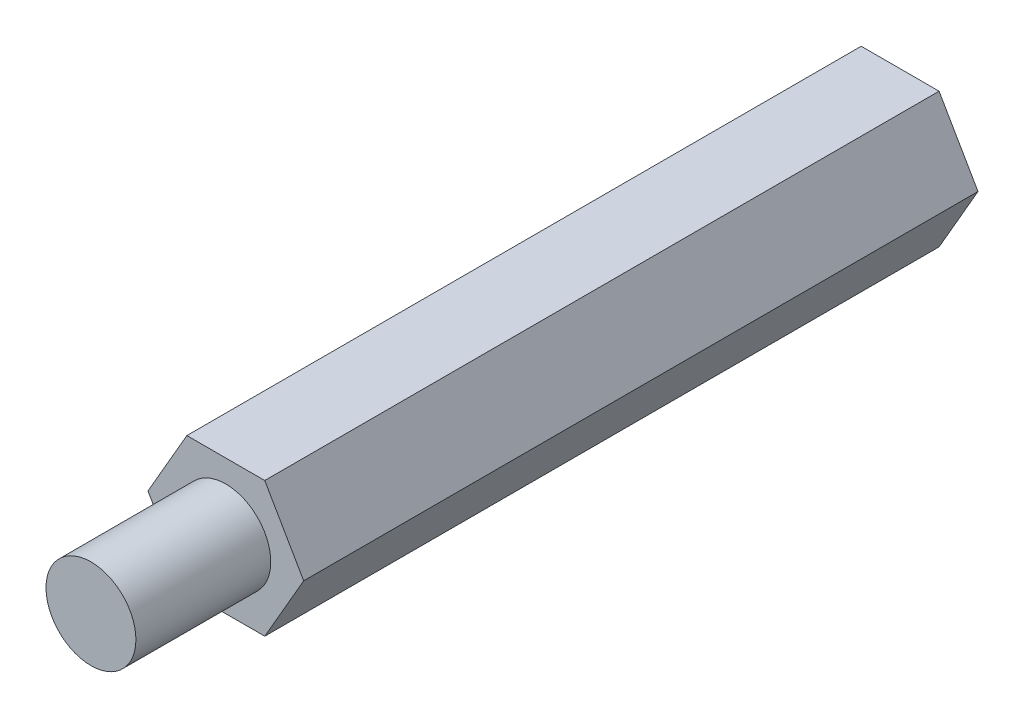
ISO-10303-21;
HEADER;
FILE_DESCRIPTION(('STEP AP214'),'2;1');
FILE_NAME('part.step','',(''),(''),'','','');
FILE_SCHEMA(('AUTOMOTIVE_DESIGN { 1 0 10303 214 1 1 1 1 }'));
ENDSEC;
DATA;
#1=APPLICATION_CONTEXT('core data for automotive mechanical design processes');
#2=APPLICATION_PROTOCOL_DEFINITION('international standard','automotive_design',2000,#1);
#3=PRODUCT_CONTEXT('',#1,'mechanical');
#4=PRODUCT('Part','Part','',(#3));
#5=PRODUCT_RELATED_PRODUCT_CATEGORY('part','',(#4));
#6=PRODUCT_DEFINITION_FORMATION('','',#4);
#7=PRODUCT_DEFINITION_CONTEXT('part definition',#1,'design');
#8=PRODUCT_DEFINITION('design','',#6,#7);
#9=PRODUCT_DEFINITION_SHAPE('','',#8);
#10=(LENGTH_UNIT() NAMED_UNIT(*) SI_UNIT(.MILLI.,.METRE.));
#11=(NAMED_UNIT(*) PLANE_ANGLE_UNIT() SI_UNIT($,.RADIAN.));
#12=(NAMED_UNIT(*) SI_UNIT($,.STERADIAN.) SOLID_ANGLE_UNIT());
#13=UNCERTAINTY_MEASURE_WITH_UNIT(LENGTH_MEASURE(1.E-05),#10,'distance_accuracy_value','');
#14=(GEOMETRIC_REPRESENTATION_CONTEXT(3) GLOBAL_UNCERTAINTY_ASSIGNED_CONTEXT((#13)) GLOBAL_UNIT_ASSIGNED_CONTEXT((#10,
#11,#12)) REPRESENTATION_CONTEXT('',''));
#15=CARTESIAN_POINT('',(0.,0.,0.));
#16=DIRECTION('',(0.,0.,1.));
#17=DIRECTION('',(1.,0.,0.));
#18=AXIS2_PLACEMENT_3D('',#15,#16,#17);
#19=CARTESIAN_POINT('',(-5.19615242270663,-3.,30.));
#20=DIRECTION('',(0.,0.,-1.));
#21=DIRECTION('',(-1.,0.,0.));
#22=AXIS2_PLACEMENT_3D('',#19,#20,#21);
#23=PLANE('',#22);
#24=DIRECTION('',(1.,0.,0.));
#25=VECTOR('',#24,1.);
#26=CARTESIAN_POINT('',(-1.73205080756888,-3.,30.));
#27=LINE('',#26,#25);
#28=CARTESIAN_POINT('',(-1.73205080756888,-3.,30.));
#29=VERTEX_POINT('',#28);
#30=CARTESIAN_POINT('',(1.73205080756888,-3.,30.));
#31=VERTEX_POINT('',#30);
#32=EDGE_CURVE('E139',#29,#31,#27,.T.);
#33=ORIENTED_EDGE('',*,*,#32,.T.);
#34=DIRECTION('',(0.5,0.866025403784439,0.));
#35=VECTOR('',#34,1.);
#36=CARTESIAN_POINT('',(1.73205080756888,-3.,30.));
#37=LINE('',#36,#35);
#38=CARTESIAN_POINT('',(3.46410161513776,0.,30.));
#39=VERTEX_POINT('',#38);
#40=EDGE_CURVE('E96',#31,#39,#37,.T.);
#41=ORIENTED_EDGE('',*,*,#40,.T.);
#42=DIRECTION('',(-0.5,0.866025403784438,0.));
#43=VECTOR('',#42,1.);
#44=CARTESIAN_POINT('',(3.46410161513776,0.,30.));
#45=LINE('',#44,#43);
#46=CARTESIAN_POINT('',(1.73205080756888,3.,30.));
#47=VERTEX_POINT('',#46);
#48=EDGE_CURVE('E110',#39,#47,#45,.T.);
#49=ORIENTED_EDGE('',*,*,#48,.T.);
#50=DIRECTION('',(-1.,0.,0.));
#51=VECTOR('',#50,1.);
#52=CARTESIAN_POINT('',(1.73205080756888,3.,30.));
#53=LINE('',#52,#51);
#54=CARTESIAN_POINT('',(-1.73205080756888,3.,30.));
#55=VERTEX_POINT('',#54);
#56=EDGE_CURVE('E104',#47,#55,#53,.T.);
#57=ORIENTED_EDGE('',*,*,#56,.T.);
#58=DIRECTION('',(-0.5,-0.866025403784439,0.));
#59=VECTOR('',#58,1.);
#60=CARTESIAN_POINT('',(-1.73205080756888,3.,30.));
#61=LINE('',#60,#59);
#62=CARTESIAN_POINT('',(-3.46410161513775,0.,30.));
#63=VERTEX_POINT('',#62);
#64=EDGE_CURVE('E108',#55,#63,#61,.T.);
#65=ORIENTED_EDGE('',*,*,#64,.T.);
#66=DIRECTION('',(0.5,-0.866025403784438,0.));
#67=VECTOR('',#66,1.);
#68=CARTESIAN_POINT('',(-3.46410161513775,0.,30.));
#69=LINE('',#68,#67);
#70=EDGE_CURVE('E57',#63,#29,#69,.T.);
#71=ORIENTED_EDGE('',*,*,#70,.T.);
#72=EDGE_LOOP('',(#33,#41,#49,#57,#65,#71));
#73=FACE_BOUND('',#72,.T.);
#74=CARTESIAN_POINT('',(0.,0.,30.));
#75=DIRECTION('',(0.,0.,-1.));
#76=DIRECTION('',(-1.,0.,0.));
#77=AXIS2_PLACEMENT_3D('',#74,#75,#76);
#78=CIRCLE('',#77,2.);
#79=CARTESIAN_POINT('',(-2.,0.,30.));
#80=VERTEX_POINT('',#79);
#81=EDGE_CURVE('E11',#80,#80,#78,.F.);
#82=ORIENTED_EDGE('',*,*,#81,.F.);
#83=EDGE_LOOP('',(#82));
#84=FACE_BOUND('',#83,.T.);
#85=ADVANCED_FACE('F40',(#73,#84),#23,.F.);
#86=CARTESIAN_POINT('',(-1.73205080756888,-3.,30.));
#87=DIRECTION('',(0.,1.,0.));
#88=DIRECTION('',(0.,0.,1.));
#89=AXIS2_PLACEMENT_3D('',#86,#87,#88);
#90=PLANE('',#89);
#91=DIRECTION('',(1.,0.,0.));
#92=VECTOR('',#91,1.);
#93=CARTESIAN_POINT('',(-1.73205080756888,-3.,0.));
#94=LINE('',#93,#92);
#95=CARTESIAN_POINT('',(-1.73205080756888,-3.,0.));
#96=VERTEX_POINT('',#95);
#97=CARTESIAN_POINT('',(1.73205080756888,-3.,0.));
#98=VERTEX_POINT('',#97);
#99=EDGE_CURVE('E128',#96,#98,#94,.T.);
#100=ORIENTED_EDGE('',*,*,#99,.T.);
#101=DIRECTION('',(0.,0.,-1.));
#102=VECTOR('',#101,1.);
#103=CARTESIAN_POINT('',(1.73205080756888,-3.,30.));
#104=LINE('',#103,#102);
#105=EDGE_CURVE('E49',#31,#98,#104,.T.);
#106=ORIENTED_EDGE('',*,*,#105,.F.);
#107=ORIENTED_EDGE('',*,*,#32,.F.);
#108=DIRECTION('',(0.,0.,-1.));
#109=VECTOR('',#108,1.);
#110=CARTESIAN_POINT('',(-1.73205080756888,-3.,30.));
#111=LINE('',#110,#109);
#112=EDGE_CURVE('E124',#29,#96,#111,.T.);
#113=ORIENTED_EDGE('',*,*,#112,.T.);
#114=EDGE_LOOP('',(#100,#106,#107,#113));
#115=FACE_BOUND('',#114,.T.);
#116=ADVANCED_FACE('F42',(#115),#90,.F.);
#117=CARTESIAN_POINT('',(1.73205080756888,-3.,30.));
#118=DIRECTION('',(-0.866025403784439,0.5,0.));
#119=DIRECTION('',(-0.5,-0.866025403784439,0.));
#120=AXIS2_PLACEMENT_3D('',#117,#118,#119);
#121=PLANE('',#120);
#122=DIRECTION('',(0.5,0.866025403784439,0.));
#123=VECTOR('',#122,1.);
#124=CARTESIAN_POINT('',(1.73205080756888,-3.,0.));
#125=LINE('',#124,#123);
#126=CARTESIAN_POINT('',(3.46410161513776,0.,0.));
#127=VERTEX_POINT('',#126);
#128=EDGE_CURVE('E131',#98,#127,#125,.T.);
#129=ORIENTED_EDGE('',*,*,#128,.T.);
#130=DIRECTION('',(0.,0.,-1.));
#131=VECTOR('',#130,1.);
#132=CARTESIAN_POINT('',(3.46410161513776,0.,30.));
#133=LINE('',#132,#131);
#134=EDGE_CURVE('E143',#39,#127,#133,.T.);
#135=ORIENTED_EDGE('',*,*,#134,.F.);
#136=ORIENTED_EDGE('',*,*,#40,.F.);
#137=ORIENTED_EDGE('',*,*,#105,.T.);
#138=EDGE_LOOP('',(#129,#135,#136,#137));
#139=FACE_BOUND('',#138,.T.);
#140=ADVANCED_FACE('F146',(#139),#121,.F.);
#141=CARTESIAN_POINT('',(3.46410161513776,0.,30.));
#142=DIRECTION('',(-0.866025403784438,-0.5,0.));
#143=DIRECTION('',(0.5,-0.866025403784438,0.));
#144=AXIS2_PLACEMENT_3D('',#141,#142,#143);
#145=PLANE('',#144);
#146=DIRECTION('',(-0.5,0.866025403784438,0.));
#147=VECTOR('',#146,1.);
#148=CARTESIAN_POINT('',(3.46410161513776,0.,0.));
#149=LINE('',#148,#147);
#150=CARTESIAN_POINT('',(1.73205080756888,3.,0.));
#151=VERTEX_POINT('',#150);
#152=EDGE_CURVE('E134',#127,#151,#149,.T.);
#153=ORIENTED_EDGE('',*,*,#152,.T.);
#154=DIRECTION('',(0.,0.,-1.));
#155=VECTOR('',#154,1.);
#156=CARTESIAN_POINT('',(1.73205080756888,3.,30.));
#157=LINE('',#156,#155);
#158=EDGE_CURVE('E119',#47,#151,#157,.T.);
#159=ORIENTED_EDGE('',*,*,#158,.F.);
#160=ORIENTED_EDGE('',*,*,#48,.F.);
#161=ORIENTED_EDGE('',*,*,#134,.T.);
#162=EDGE_LOOP('',(#153,#159,#160,#161));
#163=FACE_BOUND('',#162,.T.);
#164=ADVANCED_FACE('F154',(#163),#145,.F.);
#165=CARTESIAN_POINT('',(1.73205080756888,3.,30.));
#166=DIRECTION('',(0.,-1.,0.));
#167=DIRECTION('',(1.,0.,0.));
#168=AXIS2_PLACEMENT_3D('',#165,#166,#167);
#169=PLANE('',#168);
#170=DIRECTION('',(-1.,0.,0.));
#171=VECTOR('',#170,1.);
#172=CARTESIAN_POINT('',(1.73205080756888,3.,0.));
#173=LINE('',#172,#171);
#174=CARTESIAN_POINT('',(-1.73205080756888,3.,0.));
#175=VERTEX_POINT('',#174);
#176=EDGE_CURVE('E118',#151,#175,#173,.T.);
#177=ORIENTED_EDGE('',*,*,#176,.T.);
#178=DIRECTION('',(0.,0.,-1.));
#179=VECTOR('',#178,1.);
#180=CARTESIAN_POINT('',(-1.73205080756888,3.,30.));
#181=LINE('',#180,#179);
#182=EDGE_CURVE('E115',#55,#175,#181,.T.);
#183=ORIENTED_EDGE('',*,*,#182,.F.);
#184=ORIENTED_EDGE('',*,*,#56,.F.);
#185=ORIENTED_EDGE('',*,*,#158,.T.);
#186=EDGE_LOOP('',(#177,#183,#184,#185));
#187=FACE_BOUND('',#186,.T.);
#188=ADVANCED_FACE('F116',(#187),#169,.F.);
#189=CARTESIAN_POINT('',(-1.73205080756888,3.,30.));
#190=DIRECTION('',(0.866025403784439,-0.5,0.));
#191=DIRECTION('',(0.5,0.866025403784439,0.));
#192=AXIS2_PLACEMENT_3D('',#189,#190,#191);
#193=PLANE('',#192);
#194=DIRECTION('',(-0.5,-0.866025403784439,0.));
#195=VECTOR('',#194,1.);
#196=CARTESIAN_POINT('',(-1.73205080756888,3.,0.));
#197=LINE('',#196,#195);
#198=CARTESIAN_POINT('',(-3.46410161513775,0.,0.));
#199=VERTEX_POINT('',#198);
#200=EDGE_CURVE('E81',#175,#199,#197,.T.);
#201=ORIENTED_EDGE('',*,*,#200,.T.);
#202=DIRECTION('',(0.,0.,-1.));
#203=VECTOR('',#202,1.);
#204=CARTESIAN_POINT('',(-3.46410161513775,0.,30.));
#205=LINE('',#204,#203);
#206=EDGE_CURVE('E120',#63,#199,#205,.T.);
#207=ORIENTED_EDGE('',*,*,#206,.F.);
#208=ORIENTED_EDGE('',*,*,#64,.F.);
#209=ORIENTED_EDGE('',*,*,#182,.T.);
#210=EDGE_LOOP('',(#201,#207,#208,#209));
#211=FACE_BOUND('',#210,.T.);
#212=ADVANCED_FACE('F122',(#211),#193,.F.);
#213=CARTESIAN_POINT('',(-3.46410161513775,0.,30.));
#214=DIRECTION('',(0.866025403784438,0.5,0.));
#215=DIRECTION('',(-0.5,0.866025403784439,0.));
#216=AXIS2_PLACEMENT_3D('',#213,#214,#215);
#217=PLANE('',#216);
#218=DIRECTION('',(0.5,-0.866025403784438,0.));
#219=VECTOR('',#218,1.);
#220=CARTESIAN_POINT('',(-3.46410161513775,0.,0.));
#221=LINE('',#220,#219);
#222=EDGE_CURVE('E87',#199,#96,#221,.T.);
#223=ORIENTED_EDGE('',*,*,#222,.T.);
#224=ORIENTED_EDGE('',*,*,#112,.F.);
#225=ORIENTED_EDGE('',*,*,#70,.F.);
#226=ORIENTED_EDGE('',*,*,#206,.T.);
#227=EDGE_LOOP('',(#223,#224,#225,#226));
#228=FACE_BOUND('',#227,.T.);
#229=ADVANCED_FACE('F178',(#228),#217,.F.);
#230=CARTESIAN_POINT('',(-5.19615242270663,-3.,0.));
#231=DIRECTION('',(0.,0.,-1.));
#232=DIRECTION('',(-1.,0.,0.));
#233=AXIS2_PLACEMENT_3D('',#230,#231,#232);
#234=PLANE('',#233);
#235=CARTESIAN_POINT('',(0.,0.,0.));
#236=DIRECTION('',(0.,0.,-1.));
#237=DIRECTION('',(-1.,0.,0.));
#238=AXIS2_PLACEMENT_3D('',#235,#236,#237);
#239=CIRCLE('',#238,1.65);
#240=CARTESIAN_POINT('',(-1.65,0.,0.));
#241=VERTEX_POINT('',#240);
#242=EDGE_CURVE('E160',#241,#241,#239,.T.);
#243=ORIENTED_EDGE('',*,*,#242,.F.);
#244=EDGE_LOOP('',(#243));
#245=FACE_BOUND('',#244,.T.);
#246=ORIENTED_EDGE('',*,*,#99,.F.);
#247=ORIENTED_EDGE('',*,*,#222,.F.);
#248=ORIENTED_EDGE('',*,*,#200,.F.);
#249=ORIENTED_EDGE('',*,*,#176,.F.);
#250=ORIENTED_EDGE('',*,*,#152,.F.);
#251=ORIENTED_EDGE('',*,*,#128,.F.);
#252=EDGE_LOOP('',(#246,#247,#248,#249,#250,#251));
#253=FACE_BOUND('',#252,.T.);
#254=ADVANCED_FACE('F151',(#245,#253),#234,.T.);
#255=CARTESIAN_POINT('',(0.,0.,36.));
#256=DIRECTION('',(0.,0.,-1.));
#257=DIRECTION('',(-1.,0.,0.));
#258=AXIS2_PLACEMENT_3D('',#255,#256,#257);
#259=CYLINDRICAL_SURFACE('',#258,2.);
#260=CARTESIAN_POINT('',(0.,0.,36.));
#261=DIRECTION('',(0.,0.,1.));
#262=DIRECTION('',(1.,0.,0.));
#263=AXIS2_PLACEMENT_3D('',#260,#261,#262);
#264=CIRCLE('',#263,2.);
#265=CARTESIAN_POINT('',(2.,0.,36.));
#266=VERTEX_POINT('',#265);
#267=EDGE_CURVE('E132',#266,#266,#264,.T.);
#268=ORIENTED_EDGE('',*,*,#267,.F.);
#269=EDGE_LOOP('',(#268));
#270=FACE_BOUND('',#269,.T.);
#271=ORIENTED_EDGE('',*,*,#81,.T.);
#272=EDGE_LOOP('',(#271));
#273=FACE_BOUND('',#272,.T.);
#274=ADVANCED_FACE('F177',(#270,#273),#259,.T.);
#275=CARTESIAN_POINT('',(0.,0.,36.));
#276=DIRECTION('',(0.,0.,1.));
#277=DIRECTION('',(1.,0.,0.));
#278=AXIS2_PLACEMENT_3D('',#275,#276,#277);
#279=PLANE('',#278);
#280=ORIENTED_EDGE('',*,*,#267,.T.);
#281=EDGE_LOOP('',(#280));
#282=FACE_BOUND('',#281,.T.);
#283=ADVANCED_FACE('F172',(#282),#279,.T.);
#284=CARTESIAN_POINT('',(0.,0.,0.));
#285=DIRECTION('',(0.,0.,-1.));
#286=DIRECTION('',(-1.,0.,0.));
#287=AXIS2_PLACEMENT_3D('',#284,#285,#286);
#288=CYLINDRICAL_SURFACE('',#287,1.65);
#289=CARTESIAN_POINT('',(0.,0.,11.5));
#290=DIRECTION('',(0.,0.,-1.));
#291=DIRECTION('',(-1.,0.,0.));
#292=AXIS2_PLACEMENT_3D('',#289,#290,#291);
#293=CIRCLE('',#292,1.65);
#294=CARTESIAN_POINT('',(-1.65,0.,11.5));
#295=VERTEX_POINT('',#294);
#296=EDGE_CURVE('E163',#295,#295,#293,.T.);
#297=ORIENTED_EDGE('',*,*,#296,.F.);
#298=EDGE_LOOP('',(#297));
#299=FACE_BOUND('',#298,.T.);
#300=ORIENTED_EDGE('',*,*,#242,.T.);
#301=EDGE_LOOP('',(#300));
#302=FACE_BOUND('',#301,.T.);
#303=ADVANCED_FACE('F169',(#299,#302),#288,.F.);
#304=CARTESIAN_POINT('',(0.,0.,11.5));
#305=DIRECTION('',(0.,0.,-1.));
#306=DIRECTION('',(-1.,0.,0.));
#307=AXIS2_PLACEMENT_3D('',#304,#305,#306);
#308=CONICAL_SURFACE('',#307,1.65,1.02974425867665);
#309=CARTESIAN_POINT('',(0.,0.,12.4914200213955));
#310=VERTEX_POINT('',#309);
#311=VERTEX_LOOP('',#310);
#312=FACE_BOUND('',#311,.T.);
#313=ORIENTED_EDGE('',*,*,#296,.T.);
#314=EDGE_LOOP('',(#313));
#315=FACE_BOUND('',#314,.T.);
#316=ADVANCED_FACE('F167',(#312,#315),#308,.F.);
#317=CLOSED_SHELL('',(#85,#116,#140,#164,#188,#212,#229,#254,#274,#283,#303,#316));
#318=MANIFOLD_SOLID_BREP('B2',#317);
#319=ADVANCED_BREP_SHAPE_REPRESENTATION('',(#18,#318),#14);
#320=SHAPE_DEFINITION_REPRESENTATION(#9,#319);
ENDSEC;
END-ISO-10303-21;
